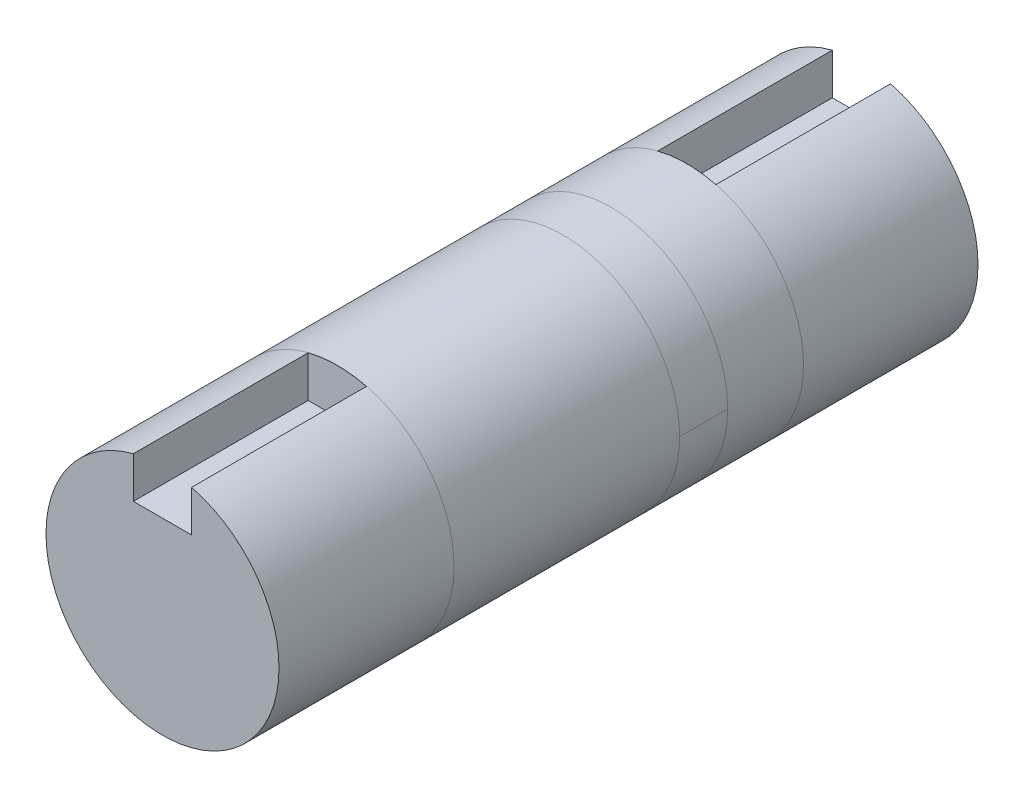
ISO-10303-21;
HEADER;
FILE_DESCRIPTION(('STEP AP214'),'2;1');
FILE_NAME('part.step','',(''),(''),'','','');
FILE_SCHEMA(('AUTOMOTIVE_DESIGN { 1 0 10303 214 1 1 1 1 }'));
ENDSEC;
DATA;
#1=APPLICATION_CONTEXT('core data for automotive mechanical design processes');
#2=APPLICATION_PROTOCOL_DEFINITION('international standard','automotive_design',2000,#1);
#3=PRODUCT_CONTEXT('',#1,'mechanical');
#4=PRODUCT('Part','Part','',(#3));
#5=PRODUCT_RELATED_PRODUCT_CATEGORY('part','',(#4));
#6=PRODUCT_DEFINITION_FORMATION('','',#4);
#7=PRODUCT_DEFINITION_CONTEXT('part definition',#1,'design');
#8=PRODUCT_DEFINITION('design','',#6,#7);
#9=PRODUCT_DEFINITION_SHAPE('','',#8);
#10=(LENGTH_UNIT() NAMED_UNIT(*) SI_UNIT(.MILLI.,.METRE.));
#11=(NAMED_UNIT(*) PLANE_ANGLE_UNIT() SI_UNIT($,.RADIAN.));
#12=(NAMED_UNIT(*) SI_UNIT($,.STERADIAN.) SOLID_ANGLE_UNIT());
#13=UNCERTAINTY_MEASURE_WITH_UNIT(LENGTH_MEASURE(1.E-05),#10,'distance_accuracy_value','');
#14=(GEOMETRIC_REPRESENTATION_CONTEXT(3) GLOBAL_UNCERTAINTY_ASSIGNED_CONTEXT((#13)) GLOBAL_UNIT_ASSIGNED_CONTEXT((#10,
#11,#12)) REPRESENTATION_CONTEXT('',''));
#15=CARTESIAN_POINT('',(0.,0.,0.));
#16=DIRECTION('',(0.,0.,1.));
#17=DIRECTION('',(1.,0.,0.));
#18=AXIS2_PLACEMENT_3D('',#15,#16,#17);
#19=CARTESIAN_POINT('',(0.,0.,-600.));
#20=DIRECTION('',(0.,0.,1.));
#21=DIRECTION('',(1.,0.,0.));
#22=AXIS2_PLACEMENT_3D('',#19,#20,#21);
#23=CYLINDRICAL_SURFACE('',#22,100.);
#24=DIRECTION('',(0.,0.,1.));
#25=VECTOR('',#24,1.);
#26=CARTESIAN_POINT('',(25.,96.8245836551854,-600.));
#27=LINE('',#26,#25);
#28=CARTESIAN_POINT('',(25.,96.8245836551854,0.));
#29=VERTEX_POINT('',#28);
#30=CARTESIAN_POINT('',(25.,96.8245836551854,-150.));
#31=VERTEX_POINT('',#30);
#32=EDGE_CURVE('E281',#29,#31,#27,.F.);
#33=ORIENTED_EDGE('',*,*,#32,.F.);
#34=CARTESIAN_POINT('',(0.,0.,0.));
#35=DIRECTION('',(0.,0.,1.));
#36=DIRECTION('',(1.,0.,0.));
#37=AXIS2_PLACEMENT_3D('',#34,#35,#36);
#38=CIRCLE('',#37,100.);
#39=CARTESIAN_POINT('',(-25.,96.8245836551854,0.));
#40=VERTEX_POINT('',#39);
#41=EDGE_CURVE('E211',#40,#29,#38,.T.);
#42=ORIENTED_EDGE('',*,*,#41,.F.);
#43=DIRECTION('',(0.,0.,1.));
#44=VECTOR('',#43,1.);
#45=CARTESIAN_POINT('',(-25.,96.8245836551854,-600.));
#46=LINE('',#45,#44);
#47=CARTESIAN_POINT('',(-25.,96.8245836551854,-150.));
#48=VERTEX_POINT('',#47);
#49=EDGE_CURVE('E286',#48,#40,#46,.T.);
#50=ORIENTED_EDGE('',*,*,#49,.F.);
#51=CARTESIAN_POINT('',(0.,0.,-150.));
#52=DIRECTION('',(0.,0.,-1.));
#53=DIRECTION('',(-1.,0.,0.));
#54=AXIS2_PLACEMENT_3D('',#51,#52,#53);
#55=CIRCLE('',#54,100.);
#56=EDGE_CURVE('E209',#31,#48,#55,.F.);
#57=ORIENTED_EDGE('',*,*,#56,.F.);
#58=EDGE_LOOP('',(#33,#42,#50,#57));
#59=FACE_BOUND('',#58,.T.);
#60=CARTESIAN_POINT('',(0.,0.,-150.289859496891));
#61=DIRECTION('',(0.,0.,-1.));
#62=DIRECTION('',(-1.,0.,0.));
#63=AXIS2_PLACEMENT_3D('',#60,#61,#62);
#64=CIRCLE('',#63,100.);
#65=CARTESIAN_POINT('',(100.,0.,-150.289859496891));
#66=VERTEX_POINT('',#65);
#67=CARTESIAN_POINT('',(-100.,0.,-150.289859496891));
#68=VERTEX_POINT('',#67);
#69=EDGE_CURVE('E55',#66,#68,#64,.F.);
#70=ORIENTED_EDGE('',*,*,#69,.T.);
#71=EDGE_CURVE('E12',#68,#66,#64,.F.);
#72=ORIENTED_EDGE('',*,*,#71,.T.);
#73=EDGE_LOOP('',(#70,#72));
#74=FACE_BOUND('',#73,.T.);
#75=ADVANCED_FACE('F51',(#59,#74),#23,.T.);
#76=CARTESIAN_POINT('',(0.,0.,-385.110782603043));
#77=DIRECTION('',(0.,0.,1.));
#78=DIRECTION('',(1.,0.,0.));
#79=AXIS2_PLACEMENT_3D('',#76,#77,#78);
#80=CIRCLE('',#79,100.);
#81=CARTESIAN_POINT('',(-100.,0.,-385.110782603043));
#82=VERTEX_POINT('',#81);
#83=CARTESIAN_POINT('',(100.,0.,-385.110782603043));
#84=VERTEX_POINT('',#83);
#85=EDGE_CURVE('E219',#82,#84,#80,.F.);
#86=ORIENTED_EDGE('',*,*,#85,.T.);
#87=EDGE_CURVE('E223',#84,#82,#80,.F.);
#88=ORIENTED_EDGE('',*,*,#87,.T.);
#89=EDGE_LOOP('',(#86,#88));
#90=FACE_BOUND('',#89,.T.);
#91=CARTESIAN_POINT('',(0.,0.,-450.18279599119));
#92=DIRECTION('',(0.,0.,-1.));
#93=DIRECTION('',(-1.,0.,0.));
#94=AXIS2_PLACEMENT_3D('',#91,#92,#93);
#95=CIRCLE('',#94,100.);
#96=CARTESIAN_POINT('',(-100.,0.,-450.18279599119));
#97=VERTEX_POINT('',#96);
#98=CARTESIAN_POINT('',(100.,0.,-450.18279599119));
#99=VERTEX_POINT('',#98);
#100=EDGE_CURVE('E237',#97,#99,#95,.F.);
#101=ORIENTED_EDGE('',*,*,#100,.T.);
#102=CARTESIAN_POINT('',(25.,96.8245836551854,-450.18279599119));
#103=VERTEX_POINT('',#102);
#104=EDGE_CURVE('E238',#99,#103,#95,.F.);
#105=ORIENTED_EDGE('',*,*,#104,.T.);
#106=DIRECTION('',(0.,0.,1.));
#107=VECTOR('',#106,1.);
#108=CARTESIAN_POINT('',(25.,96.8245836551854,-600.));
#109=LINE('',#108,#107);
#110=CARTESIAN_POINT('',(25.,96.8245836551854,-450.));
#111=VERTEX_POINT('',#110);
#112=EDGE_CURVE('E187',#111,#103,#109,.F.);
#113=ORIENTED_EDGE('',*,*,#112,.F.);
#114=CARTESIAN_POINT('',(0.,0.,-450.));
#115=DIRECTION('',(0.,0.,1.));
#116=DIRECTION('',(1.,0.,0.));
#117=AXIS2_PLACEMENT_3D('',#114,#115,#116);
#118=CIRCLE('',#117,100.);
#119=CARTESIAN_POINT('',(-25.,96.8245836551854,-450.));
#120=VERTEX_POINT('',#119);
#121=EDGE_CURVE('E149',#120,#111,#118,.F.);
#122=ORIENTED_EDGE('',*,*,#121,.F.);
#123=DIRECTION('',(0.,0.,1.));
#124=VECTOR('',#123,1.);
#125=CARTESIAN_POINT('',(-25.,96.8245836551854,-600.));
#126=LINE('',#125,#124);
#127=CARTESIAN_POINT('',(-25.,96.8245836551854,-450.18279599119));
#128=VERTEX_POINT('',#127);
#129=EDGE_CURVE('E190',#128,#120,#126,.T.);
#130=ORIENTED_EDGE('',*,*,#129,.F.);
#131=EDGE_CURVE('E234',#128,#97,#95,.F.);
#132=ORIENTED_EDGE('',*,*,#131,.T.);
#133=EDGE_LOOP('',(#101,#105,#113,#122,#130,#132));
#134=FACE_BOUND('',#133,.T.);
#135=ADVANCED_FACE('F264',(#90,#134),#23,.T.);
#136=CARTESIAN_POINT('',(0.,0.,-343.895461156151));
#137=DIRECTION('',(0.,0.,-1.));
#138=DIRECTION('',(-1.,0.,0.));
#139=AXIS2_PLACEMENT_3D('',#136,#137,#138);
#140=CIRCLE('',#139,100.);
#141=CARTESIAN_POINT('',(-100.,0.,-343.895461156151));
#142=VERTEX_POINT('',#141);
#143=CARTESIAN_POINT('',(100.,0.,-343.895461156151));
#144=VERTEX_POINT('',#143);
#145=EDGE_CURVE('E231',#142,#144,#140,.F.);
#146=ORIENTED_EDGE('',*,*,#145,.F.);
#147=DIRECTION('',(0.,0.,1.));
#148=VECTOR('',#147,1.);
#149=CARTESIAN_POINT('',(-100.,0.,-600.));
#150=LINE('',#149,#148);
#151=EDGE_CURVE('E232',#142,#82,#150,.F.);
#152=ORIENTED_EDGE('',*,*,#151,.T.);
#153=ORIENTED_EDGE('',*,*,#87,.F.);
#154=DIRECTION('',(0.,0.,1.));
#155=VECTOR('',#154,1.);
#156=CARTESIAN_POINT('',(100.,0.,-600.));
#157=LINE('',#156,#155);
#158=EDGE_CURVE('E224',#144,#84,#157,.F.);
#159=ORIENTED_EDGE('',*,*,#158,.F.);
#160=EDGE_LOOP('',(#146,#152,#153,#159));
#161=FACE_BOUND('',#160,.T.);
#162=ADVANCED_FACE('F253',(#161),#23,.T.);
#163=ORIENTED_EDGE('',*,*,#71,.F.);
#164=ORIENTED_EDGE('',*,*,#69,.F.);
#165=EDGE_LOOP('',(#163,#164));
#166=FACE_BOUND('',#165,.T.);
#167=EDGE_CURVE('E227',#144,#142,#140,.F.);
#168=ORIENTED_EDGE('',*,*,#167,.T.);
#169=ORIENTED_EDGE('',*,*,#145,.T.);
#170=EDGE_LOOP('',(#168,#169));
#171=FACE_BOUND('',#170,.T.);
#172=ADVANCED_FACE('F249',(#166,#171),#23,.T.);
#173=ORIENTED_EDGE('',*,*,#104,.F.);
#174=ORIENTED_EDGE('',*,*,#100,.F.);
#175=ORIENTED_EDGE('',*,*,#131,.F.);
#176=CARTESIAN_POINT('',(-25.,96.8245836551854,-600.));
#177=VERTEX_POINT('',#176);
#178=EDGE_CURVE('E192',#177,#128,#126,.T.);
#179=ORIENTED_EDGE('',*,*,#178,.F.);
#180=CARTESIAN_POINT('',(0.,0.,-600.));
#181=DIRECTION('',(0.,0.,1.));
#182=DIRECTION('',(1.,0.,0.));
#183=AXIS2_PLACEMENT_3D('',#180,#181,#182);
#184=CIRCLE('',#183,100.);
#185=CARTESIAN_POINT('',(25.,96.8245836551854,-600.));
#186=VERTEX_POINT('',#185);
#187=EDGE_CURVE('E210',#177,#186,#184,.T.);
#188=ORIENTED_EDGE('',*,*,#187,.T.);
#189=EDGE_CURVE('E191',#103,#186,#109,.F.);
#190=ORIENTED_EDGE('',*,*,#189,.F.);
#191=EDGE_LOOP('',(#173,#174,#175,#179,#188,#190));
#192=FACE_BOUND('',#191,.T.);
#193=ADVANCED_FACE('F252',(#192),#23,.T.);
#194=ORIENTED_EDGE('',*,*,#151,.F.);
#195=ORIENTED_EDGE('',*,*,#167,.F.);
#196=ORIENTED_EDGE('',*,*,#158,.T.);
#197=ORIENTED_EDGE('',*,*,#85,.F.);
#198=EDGE_LOOP('',(#194,#195,#196,#197));
#199=FACE_BOUND('',#198,.T.);
#200=ADVANCED_FACE('F53',(#199),#23,.T.);
#201=CARTESIAN_POINT('',(0.,0.,-600.));
#202=DIRECTION('',(0.,0.,1.));
#203=DIRECTION('',(1.,0.,0.));
#204=AXIS2_PLACEMENT_3D('',#201,#202,#203);
#205=PLANE('',#204);
#206=ORIENTED_EDGE('',*,*,#187,.F.);
#207=DIRECTION('',(0.,1.,0.));
#208=VECTOR('',#207,1.);
#209=CARTESIAN_POINT('',(-25.,61.4,-600.));
#210=LINE('',#209,#208);
#211=CARTESIAN_POINT('',(-25.,61.4,-600.));
#212=VERTEX_POINT('',#211);
#213=EDGE_CURVE('E175',#212,#177,#210,.T.);
#214=ORIENTED_EDGE('',*,*,#213,.F.);
#215=DIRECTION('',(-1.,0.,0.));
#216=VECTOR('',#215,1.);
#217=CARTESIAN_POINT('',(25.,61.4,-600.));
#218=LINE('',#217,#216);
#219=CARTESIAN_POINT('',(25.,61.4,-600.));
#220=VERTEX_POINT('',#219);
#221=EDGE_CURVE('E527',#220,#212,#218,.T.);
#222=ORIENTED_EDGE('',*,*,#221,.F.);
#223=DIRECTION('',(0.,1.,0.));
#224=VECTOR('',#223,1.);
#225=CARTESIAN_POINT('',(25.,0.,-600.));
#226=LINE('',#225,#224);
#227=EDGE_CURVE('E160',#220,#186,#226,.T.);
#228=ORIENTED_EDGE('',*,*,#227,.T.);
#229=EDGE_LOOP('',(#206,#214,#222,#228));
#230=FACE_BOUND('',#229,.T.);
#231=ADVANCED_FACE('F276',(#230),#205,.F.);
#232=CARTESIAN_POINT('',(0.,0.,0.));
#233=DIRECTION('',(0.,0.,1.));
#234=DIRECTION('',(1.,0.,0.));
#235=AXIS2_PLACEMENT_3D('',#232,#233,#234);
#236=PLANE('',#235);
#237=DIRECTION('',(0.,1.,0.));
#238=VECTOR('',#237,1.);
#239=CARTESIAN_POINT('',(25.,61.4,0.));
#240=LINE('',#239,#238);
#241=CARTESIAN_POINT('',(25.,61.4,0.));
#242=VERTEX_POINT('',#241);
#243=EDGE_CURVE('E197',#242,#29,#240,.T.);
#244=ORIENTED_EDGE('',*,*,#243,.F.);
#245=DIRECTION('',(1.,0.,0.));
#246=VECTOR('',#245,1.);
#247=CARTESIAN_POINT('',(-25.,61.4,0.));
#248=LINE('',#247,#246);
#249=CARTESIAN_POINT('',(-25.,61.4,0.));
#250=VERTEX_POINT('',#249);
#251=EDGE_CURVE('E297',#250,#242,#248,.T.);
#252=ORIENTED_EDGE('',*,*,#251,.F.);
#253=DIRECTION('',(0.,-1.,0.));
#254=VECTOR('',#253,1.);
#255=CARTESIAN_POINT('',(-25.,0.,0.));
#256=LINE('',#255,#254);
#257=EDGE_CURVE('E205',#40,#250,#256,.T.);
#258=ORIENTED_EDGE('',*,*,#257,.F.);
#259=ORIENTED_EDGE('',*,*,#41,.T.);
#260=EDGE_LOOP('',(#244,#252,#258,#259));
#261=FACE_BOUND('',#260,.T.);
#262=ADVANCED_FACE('F329',(#261),#236,.T.);
#263=CARTESIAN_POINT('',(25.,61.4,-150.));
#264=DIRECTION('',(1.,0.,0.));
#265=DIRECTION('',(0.,0.,-1.));
#266=AXIS2_PLACEMENT_3D('',#263,#264,#265);
#267=PLANE('',#266);
#268=ORIENTED_EDGE('',*,*,#32,.T.);
#269=DIRECTION('',(0.,1.,0.));
#270=VECTOR('',#269,1.);
#271=CARTESIAN_POINT('',(25.,61.4,-150.));
#272=LINE('',#271,#270);
#273=CARTESIAN_POINT('',(25.,61.4,-150.));
#274=VERTEX_POINT('',#273);
#275=EDGE_CURVE('E198',#274,#31,#272,.T.);
#276=ORIENTED_EDGE('',*,*,#275,.F.);
#277=DIRECTION('',(0.,0.,1.));
#278=VECTOR('',#277,1.);
#279=CARTESIAN_POINT('',(25.,61.4,-150.));
#280=LINE('',#279,#278);
#281=EDGE_CURVE('E288',#274,#242,#280,.T.);
#282=ORIENTED_EDGE('',*,*,#281,.T.);
#283=ORIENTED_EDGE('',*,*,#243,.T.);
#284=EDGE_LOOP('',(#268,#276,#282,#283));
#285=FACE_BOUND('',#284,.T.);
#286=ADVANCED_FACE('F332',(#285),#267,.F.);
#287=CARTESIAN_POINT('',(-25.,61.4,-150.));
#288=DIRECTION('',(0.,-1.,0.));
#289=DIRECTION('',(0.,0.,-1.));
#290=AXIS2_PLACEMENT_3D('',#287,#288,#289);
#291=PLANE('',#290);
#292=ORIENTED_EDGE('',*,*,#251,.T.);
#293=ORIENTED_EDGE('',*,*,#281,.F.);
#294=DIRECTION('',(1.,0.,0.));
#295=VECTOR('',#294,1.);
#296=CARTESIAN_POINT('',(-25.,61.4,-150.));
#297=LINE('',#296,#295);
#298=CARTESIAN_POINT('',(-25.,61.4,-150.));
#299=VERTEX_POINT('',#298);
#300=EDGE_CURVE('E294',#299,#274,#297,.T.);
#301=ORIENTED_EDGE('',*,*,#300,.F.);
#302=DIRECTION('',(0.,0.,1.));
#303=VECTOR('',#302,1.);
#304=CARTESIAN_POINT('',(-25.,61.4,-150.));
#305=LINE('',#304,#303);
#306=EDGE_CURVE('E289',#299,#250,#305,.T.);
#307=ORIENTED_EDGE('',*,*,#306,.T.);
#308=EDGE_LOOP('',(#292,#293,#301,#307));
#309=FACE_BOUND('',#308,.T.);
#310=ADVANCED_FACE('F331',(#309),#291,.F.);
#311=CARTESIAN_POINT('',(-25.,61.4,-150.));
#312=DIRECTION('',(-1.,0.,0.));
#313=DIRECTION('',(0.,0.,1.));
#314=AXIS2_PLACEMENT_3D('',#311,#312,#313);
#315=PLANE('',#314);
#316=ORIENTED_EDGE('',*,*,#49,.T.);
#317=ORIENTED_EDGE('',*,*,#257,.T.);
#318=ORIENTED_EDGE('',*,*,#306,.F.);
#319=DIRECTION('',(0.,-1.,0.));
#320=VECTOR('',#319,1.);
#321=CARTESIAN_POINT('',(-25.,61.4,-150.));
#322=LINE('',#321,#320);
#323=EDGE_CURVE('E305',#48,#299,#322,.T.);
#324=ORIENTED_EDGE('',*,*,#323,.F.);
#325=EDGE_LOOP('',(#316,#317,#318,#324));
#326=FACE_BOUND('',#325,.T.);
#327=ADVANCED_FACE('F325',(#326),#315,.F.);
#328=CARTESIAN_POINT('',(0.,0.,-150.));
#329=DIRECTION('',(0.,0.,-1.));
#330=DIRECTION('',(-1.,0.,0.));
#331=AXIS2_PLACEMENT_3D('',#328,#329,#330);
#332=PLANE('',#331);
#333=ORIENTED_EDGE('',*,*,#56,.T.);
#334=ORIENTED_EDGE('',*,*,#323,.T.);
#335=ORIENTED_EDGE('',*,*,#300,.T.);
#336=ORIENTED_EDGE('',*,*,#275,.T.);
#337=EDGE_LOOP('',(#333,#334,#335,#336));
#338=FACE_BOUND('',#337,.T.);
#339=ADVANCED_FACE('F316',(#338),#332,.F.);
#340=CARTESIAN_POINT('',(-25.,61.4,-450.));
#341=DIRECTION('',(-1.,0.,0.));
#342=DIRECTION('',(0.,0.,1.));
#343=AXIS2_PLACEMENT_3D('',#340,#341,#342);
#344=PLANE('',#343);
#345=ORIENTED_EDGE('',*,*,#178,.T.);
#346=ORIENTED_EDGE('',*,*,#129,.T.);
#347=DIRECTION('',(0.,1.,0.));
#348=VECTOR('',#347,1.);
#349=CARTESIAN_POINT('',(-25.,61.4,-450.));
#350=LINE('',#349,#348);
#351=CARTESIAN_POINT('',(-25.,61.4,-450.));
#352=VERTEX_POINT('',#351);
#353=EDGE_CURVE('E154',#352,#120,#350,.T.);
#354=ORIENTED_EDGE('',*,*,#353,.F.);
#355=DIRECTION('',(0.,0.,-1.));
#356=VECTOR('',#355,1.);
#357=CARTESIAN_POINT('',(-25.,61.4,-450.));
#358=LINE('',#357,#356);
#359=EDGE_CURVE('E165',#352,#212,#358,.T.);
#360=ORIENTED_EDGE('',*,*,#359,.T.);
#361=ORIENTED_EDGE('',*,*,#213,.T.);
#362=EDGE_LOOP('',(#345,#346,#354,#360,#361));
#363=FACE_BOUND('',#362,.T.);
#364=ADVANCED_FACE('F273',(#363),#344,.F.);
#365=CARTESIAN_POINT('',(25.,61.4,-450.));
#366=DIRECTION('',(0.,-1.,0.));
#367=DIRECTION('',(0.,0.,-1.));
#368=AXIS2_PLACEMENT_3D('',#365,#366,#367);
#369=PLANE('',#368);
#370=ORIENTED_EDGE('',*,*,#221,.T.);
#371=ORIENTED_EDGE('',*,*,#359,.F.);
#372=DIRECTION('',(-1.,0.,0.));
#373=VECTOR('',#372,1.);
#374=CARTESIAN_POINT('',(25.,61.4,-450.));
#375=LINE('',#374,#373);
#376=CARTESIAN_POINT('',(25.,61.4,-450.));
#377=VERTEX_POINT('',#376);
#378=EDGE_CURVE('E147',#377,#352,#375,.T.);
#379=ORIENTED_EDGE('',*,*,#378,.F.);
#380=DIRECTION('',(0.,0.,-1.));
#381=VECTOR('',#380,1.);
#382=CARTESIAN_POINT('',(25.,61.4,-450.));
#383=LINE('',#382,#381);
#384=EDGE_CURVE('E157',#377,#220,#383,.T.);
#385=ORIENTED_EDGE('',*,*,#384,.T.);
#386=EDGE_LOOP('',(#370,#371,#379,#385));
#387=FACE_BOUND('',#386,.T.);
#388=ADVANCED_FACE('F167',(#387),#369,.F.);
#389=CARTESIAN_POINT('',(25.,61.4,-450.));
#390=DIRECTION('',(1.,0.,0.));
#391=DIRECTION('',(0.,0.,-1.));
#392=AXIS2_PLACEMENT_3D('',#389,#390,#391);
#393=PLANE('',#392);
#394=ORIENTED_EDGE('',*,*,#112,.T.);
#395=ORIENTED_EDGE('',*,*,#189,.T.);
#396=ORIENTED_EDGE('',*,*,#227,.F.);
#397=ORIENTED_EDGE('',*,*,#384,.F.);
#398=DIRECTION('',(0.,-1.,0.));
#399=VECTOR('',#398,1.);
#400=CARTESIAN_POINT('',(25.,61.4,-450.));
#401=LINE('',#400,#399);
#402=EDGE_CURVE('E142',#111,#377,#401,.T.);
#403=ORIENTED_EDGE('',*,*,#402,.F.);
#404=EDGE_LOOP('',(#394,#395,#396,#397,#403));
#405=FACE_BOUND('',#404,.T.);
#406=ADVANCED_FACE('F158',(#405),#393,.F.);
#407=CARTESIAN_POINT('',(0.,0.,-450.));
#408=DIRECTION('',(0.,0.,1.));
#409=DIRECTION('',(1.,0.,0.));
#410=AXIS2_PLACEMENT_3D('',#407,#408,#409);
#411=PLANE('',#410);
#412=ORIENTED_EDGE('',*,*,#121,.T.);
#413=ORIENTED_EDGE('',*,*,#402,.T.);
#414=ORIENTED_EDGE('',*,*,#378,.T.);
#415=ORIENTED_EDGE('',*,*,#353,.T.);
#416=EDGE_LOOP('',(#412,#413,#414,#415));
#417=FACE_BOUND('',#416,.T.);
#418=ADVANCED_FACE('F144',(#417),#411,.F.);
#419=CLOSED_SHELL('',(#75,#135,#162,#172,#193,#200,#231,#262,#286,#310,#327,#339,#364,#388,#406,#418));
#420=MANIFOLD_SOLID_BREP('B2',#419);
#421=ADVANCED_BREP_SHAPE_REPRESENTATION('',(#18,#420),#14);
#422=SHAPE_DEFINITION_REPRESENTATION(#9,#421);
ENDSEC;
END-ISO-10303-21;
